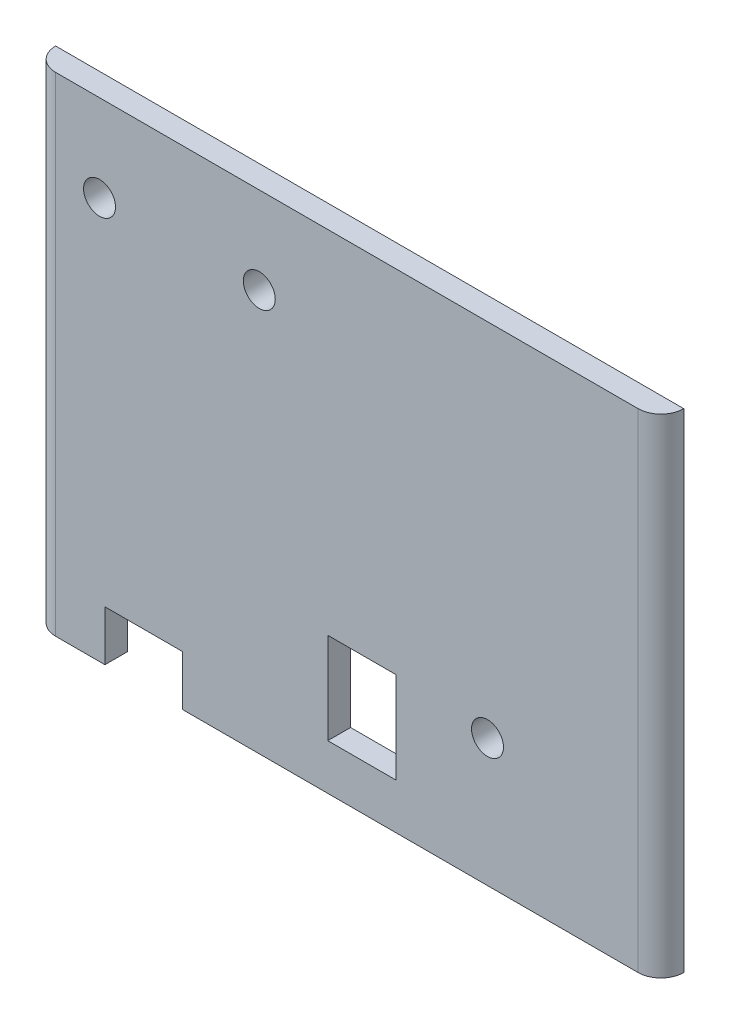
ISO-10303-21;
HEADER;
FILE_DESCRIPTION(('STEP AP214'),'2;1');
FILE_NAME('part.step','',(''),(''),'','','');
FILE_SCHEMA(('AUTOMOTIVE_DESIGN { 1 0 10303 214 1 1 1 1 }'));
ENDSEC;
DATA;
#1=APPLICATION_CONTEXT('core data for automotive mechanical design processes');
#2=APPLICATION_PROTOCOL_DEFINITION('international standard','automotive_design',2000,#1);
#3=PRODUCT_CONTEXT('',#1,'mechanical');
#4=PRODUCT('Part','Part','',(#3));
#5=PRODUCT_RELATED_PRODUCT_CATEGORY('part','',(#4));
#6=PRODUCT_DEFINITION_FORMATION('','',#4);
#7=PRODUCT_DEFINITION_CONTEXT('part definition',#1,'design');
#8=PRODUCT_DEFINITION('design','',#6,#7);
#9=PRODUCT_DEFINITION_SHAPE('','',#8);
#10=(LENGTH_UNIT() NAMED_UNIT(*) SI_UNIT(.MILLI.,.METRE.));
#11=(NAMED_UNIT(*) PLANE_ANGLE_UNIT() SI_UNIT($,.RADIAN.));
#12=(NAMED_UNIT(*) SI_UNIT($,.STERADIAN.) SOLID_ANGLE_UNIT());
#13=UNCERTAINTY_MEASURE_WITH_UNIT(LENGTH_MEASURE(1.E-05),#10,'distance_accuracy_value','');
#14=(GEOMETRIC_REPRESENTATION_CONTEXT(3) GLOBAL_UNCERTAINTY_ASSIGNED_CONTEXT((#13)) GLOBAL_UNIT_ASSIGNED_CONTEXT((#10,
#11,#12)) REPRESENTATION_CONTEXT('',''));
#15=CARTESIAN_POINT('',(0.,0.,0.));
#16=DIRECTION('',(0.,0.,1.));
#17=DIRECTION('',(1.,0.,0.));
#18=AXIS2_PLACEMENT_3D('',#15,#16,#17);
#19=CARTESIAN_POINT('',(5.38,138.622751322752,65.));
#20=DIRECTION('',(0.,0.,1.));
#21=DIRECTION('',(0.,-1.,0.));
#22=AXIS2_PLACEMENT_3D('',#19,#20,#21);
#23=PLANE('',#22);
#24=DIRECTION('',(0.,-1.,0.));
#25=VECTOR('',#24,1.);
#26=CARTESIAN_POINT('',(24.,120.,65.));
#27=LINE('',#26,#25);
#28=CARTESIAN_POINT('',(24.,120.,65.));
#29=VERTEX_POINT('',#28);
#30=CARTESIAN_POINT('',(24.,112.,65.));
#31=VERTEX_POINT('',#30);
#32=EDGE_CURVE('E217',#29,#31,#27,.T.);
#33=ORIENTED_EDGE('',*,*,#32,.F.);
#34=DIRECTION('',(1.,0.,0.));
#35=VECTOR('',#34,1.);
#36=CARTESIAN_POINT('',(16.,120.,65.));
#37=LINE('',#36,#35);
#38=CARTESIAN_POINT('',(16.,120.,65.));
#39=VERTEX_POINT('',#38);
#40=EDGE_CURVE('E230',#39,#29,#37,.T.);
#41=ORIENTED_EDGE('',*,*,#40,.F.);
#42=DIRECTION('',(0.,1.,0.));
#43=VECTOR('',#42,1.);
#44=CARTESIAN_POINT('',(16.,120.,65.));
#45=LINE('',#44,#43);
#46=CARTESIAN_POINT('',(16.,112.,65.));
#47=VERTEX_POINT('',#46);
#48=EDGE_CURVE('E239',#47,#39,#45,.T.);
#49=ORIENTED_EDGE('',*,*,#48,.F.);
#50=DIRECTION('',(-1.,0.,0.));
#51=VECTOR('',#50,1.);
#52=CARTESIAN_POINT('',(16.,112.,65.));
#53=LINE('',#52,#51);
#54=EDGE_CURVE('E220',#31,#47,#53,.T.);
#55=ORIENTED_EDGE('',*,*,#54,.F.);
#56=EDGE_LOOP('',(#33,#41,#49,#55));
#57=FACE_BOUND('',#56,.T.);
#58=DIRECTION('',(-1.,0.,0.));
#59=VECTOR('',#58,1.);
#60=CARTESIAN_POINT('',(70.,38.,65.));
#61=LINE('',#60,#59);
#62=CARTESIAN_POINT('',(85.,38.,65.));
#63=VERTEX_POINT('',#62);
#64=CARTESIAN_POINT('',(70.,38.,65.));
#65=VERTEX_POINT('',#64);
#66=EDGE_CURVE('E309',#63,#65,#61,.T.);
#67=ORIENTED_EDGE('',*,*,#66,.F.);
#68=DIRECTION('',(0.,-1.,0.));
#69=VECTOR('',#68,1.);
#70=CARTESIAN_POINT('',(85.,38.,65.));
#71=LINE('',#70,#69);
#72=CARTESIAN_POINT('',(85.,58.,65.));
#73=VERTEX_POINT('',#72);
#74=EDGE_CURVE('E312',#73,#63,#71,.T.);
#75=ORIENTED_EDGE('',*,*,#74,.F.);
#76=DIRECTION('',(1.,0.,0.));
#77=VECTOR('',#76,1.);
#78=CARTESIAN_POINT('',(70.,58.,65.));
#79=LINE('',#78,#77);
#80=CARTESIAN_POINT('',(70.,58.,65.));
#81=VERTEX_POINT('',#80);
#82=EDGE_CURVE('E315',#81,#73,#79,.T.);
#83=ORIENTED_EDGE('',*,*,#82,.F.);
#84=DIRECTION('',(0.,1.,0.));
#85=VECTOR('',#84,1.);
#86=CARTESIAN_POINT('',(70.,38.,65.));
#87=LINE('',#86,#85);
#88=EDGE_CURVE('E318',#65,#81,#87,.T.);
#89=ORIENTED_EDGE('',*,*,#88,.F.);
#90=EDGE_LOOP('',(#67,#75,#83,#89));
#91=FACE_BOUND('',#90,.T.);
#92=DIRECTION('',(0.,1.,0.));
#93=VECTOR('',#92,1.);
#94=CARTESIAN_POINT('',(143.,0.,65.));
#95=LINE('',#94,#93);
#96=CARTESIAN_POINT('',(143.,28.,65.));
#97=VERTEX_POINT('',#96);
#98=CARTESIAN_POINT('',(143.,135.,65.));
#99=VERTEX_POINT('',#98);
#100=EDGE_CURVE('E303',#97,#99,#95,.T.);
#101=ORIENTED_EDGE('',*,*,#100,.F.);
#102=DIRECTION('',(1.,0.,0.));
#103=VECTOR('',#102,1.);
#104=CARTESIAN_POINT('',(0.,28.,65.));
#105=LINE('',#104,#103);
#106=CARTESIAN_POINT('',(38.18,28.0000000000001,65.));
#107=VERTEX_POINT('',#106);
#108=EDGE_CURVE('E300',#107,#97,#105,.T.);
#109=ORIENTED_EDGE('',*,*,#108,.F.);
#110=DIRECTION('',(0.,-1.,0.));
#111=VECTOR('',#110,1.);
#112=CARTESIAN_POINT('',(38.18,28.0000000000001,65.));
#113=LINE('',#112,#111);
#114=CARTESIAN_POINT('',(38.18,39.0000000000001,65.));
#115=VERTEX_POINT('',#114);
#116=EDGE_CURVE('E297',#115,#107,#113,.T.);
#117=ORIENTED_EDGE('',*,*,#116,.F.);
#118=DIRECTION('',(1.,0.,0.));
#119=VECTOR('',#118,1.);
#120=CARTESIAN_POINT('',(21.18,39.0000000000001,65.));
#121=LINE('',#120,#119);
#122=CARTESIAN_POINT('',(21.18,39.0000000000001,65.));
#123=VERTEX_POINT('',#122);
#124=EDGE_CURVE('E294',#123,#115,#121,.T.);
#125=ORIENTED_EDGE('',*,*,#124,.F.);
#126=DIRECTION('',(0.,1.,0.));
#127=VECTOR('',#126,1.);
#128=CARTESIAN_POINT('',(21.18,28.0000000000001,65.));
#129=LINE('',#128,#127);
#130=CARTESIAN_POINT('',(21.18,28.0000000000001,65.));
#131=VERTEX_POINT('',#130);
#132=EDGE_CURVE('E291',#131,#123,#129,.T.);
#133=ORIENTED_EDGE('',*,*,#132,.F.);
#134=DIRECTION('',(1.,0.,0.));
#135=VECTOR('',#134,1.);
#136=CARTESIAN_POINT('',(0.,28.,65.));
#137=LINE('',#136,#135);
#138=CARTESIAN_POINT('',(5.38,28.,65.));
#139=VERTEX_POINT('',#138);
#140=EDGE_CURVE('E366',#139,#131,#137,.T.);
#141=ORIENTED_EDGE('',*,*,#140,.F.);
#142=DIRECTION('',(0.,-1.,0.));
#143=VECTOR('',#142,1.);
#144=CARTESIAN_POINT('',(5.38,138.622751322752,65.));
#145=LINE('',#144,#143);
#146=CARTESIAN_POINT('',(5.38,135.,65.));
#147=VERTEX_POINT('',#146);
#148=EDGE_CURVE('E288',#147,#139,#145,.T.);
#149=ORIENTED_EDGE('',*,*,#148,.F.);
#150=DIRECTION('',(-1.,0.,0.));
#151=VECTOR('',#150,1.);
#152=CARTESIAN_POINT('',(0.,135.,65.));
#153=LINE('',#152,#151);
#154=EDGE_CURVE('E306',#99,#147,#153,.T.);
#155=ORIENTED_EDGE('',*,*,#154,.F.);
#156=EDGE_LOOP('',(#101,#109,#117,#125,#133,#141,#149,#155));
#157=FACE_BOUND('',#156,.T.);
#158=DIRECTION('',(0.,1.,0.));
#159=VECTOR('',#158,1.);
#160=CARTESIAN_POINT('',(51.,112.,65.));
#161=LINE('',#160,#159);
#162=CARTESIAN_POINT('',(51.,112.,65.));
#163=VERTEX_POINT('',#162);
#164=CARTESIAN_POINT('',(51.,120.,65.));
#165=VERTEX_POINT('',#164);
#166=EDGE_CURVE('E255',#163,#165,#161,.T.);
#167=ORIENTED_EDGE('',*,*,#166,.F.);
#168=DIRECTION('',(-1.,0.,0.));
#169=VECTOR('',#168,1.);
#170=CARTESIAN_POINT('',(59.,112.,65.));
#171=LINE('',#170,#169);
#172=CARTESIAN_POINT('',(59.,112.,65.));
#173=VERTEX_POINT('',#172);
#174=EDGE_CURVE('E260',#173,#163,#171,.T.);
#175=ORIENTED_EDGE('',*,*,#174,.F.);
#176=DIRECTION('',(0.,-1.,0.));
#177=VECTOR('',#176,1.);
#178=CARTESIAN_POINT('',(59.,112.,65.));
#179=LINE('',#178,#177);
#180=CARTESIAN_POINT('',(59.,120.,65.));
#181=VERTEX_POINT('',#180);
#182=EDGE_CURVE('E272',#181,#173,#179,.T.);
#183=ORIENTED_EDGE('',*,*,#182,.F.);
#184=DIRECTION('',(1.,0.,0.));
#185=VECTOR('',#184,1.);
#186=CARTESIAN_POINT('',(59.,120.,65.));
#187=LINE('',#186,#185);
#188=EDGE_CURVE('E269',#165,#181,#187,.T.);
#189=ORIENTED_EDGE('',*,*,#188,.F.);
#190=EDGE_LOOP('',(#167,#175,#183,#189));
#191=FACE_BOUND('',#190,.T.);
#192=DIRECTION('',(0.,1.,0.));
#193=VECTOR('',#192,1.);
#194=CARTESIAN_POINT('',(101.,52.,65.));
#195=LINE('',#194,#193);
#196=CARTESIAN_POINT('',(101.,52.,65.));
#197=VERTEX_POINT('',#196);
#198=CARTESIAN_POINT('',(101.,60.0000000000001,65.));
#199=VERTEX_POINT('',#198);
#200=EDGE_CURVE('E216',#197,#199,#195,.T.);
#201=ORIENTED_EDGE('',*,*,#200,.F.);
#202=DIRECTION('',(-1.,0.,0.));
#203=VECTOR('',#202,1.);
#204=CARTESIAN_POINT('',(109.,52.,65.));
#205=LINE('',#204,#203);
#206=CARTESIAN_POINT('',(109.,52.,65.));
#207=VERTEX_POINT('',#206);
#208=EDGE_CURVE('E213',#207,#197,#205,.T.);
#209=ORIENTED_EDGE('',*,*,#208,.F.);
#210=DIRECTION('',(0.,-1.,0.));
#211=VECTOR('',#210,1.);
#212=CARTESIAN_POINT('',(109.,52.,65.));
#213=LINE('',#212,#211);
#214=CARTESIAN_POINT('',(109.,60.0000000000001,65.));
#215=VERTEX_POINT('',#214);
#216=EDGE_CURVE('E56',#215,#207,#213,.T.);
#217=ORIENTED_EDGE('',*,*,#216,.F.);
#218=DIRECTION('',(1.,0.,0.));
#219=VECTOR('',#218,1.);
#220=CARTESIAN_POINT('',(109.,60.0000000000001,65.));
#221=LINE('',#220,#219);
#222=EDGE_CURVE('E51',#199,#215,#221,.T.);
#223=ORIENTED_EDGE('',*,*,#222,.F.);
#224=EDGE_LOOP('',(#201,#209,#217,#223));
#225=FACE_BOUND('',#224,.T.);
#226=ADVANCED_FACE('F34',(#57,#91,#157,#191,#225),#23,.F.);
#227=CARTESIAN_POINT('',(0.,135.,70.));
#228=DIRECTION('',(0.,-1.,0.));
#229=DIRECTION('',(0.,0.,-1.));
#230=AXIS2_PLACEMENT_3D('',#227,#228,#229);
#231=PLANE('',#230);
#232=ORIENTED_EDGE('',*,*,#154,.T.);
#233=CARTESIAN_POINT('',(10.38,135.,65.));
#234=DIRECTION('',(0.,-1.,0.));
#235=DIRECTION('',(0.,0.,-1.));
#236=AXIS2_PLACEMENT_3D('',#233,#234,#235);
#237=CIRCLE('',#236,5.);
#238=CARTESIAN_POINT('',(10.38,135.,70.));
#239=VERTEX_POINT('',#238);
#240=EDGE_CURVE('E43',#147,#239,#237,.F.);
#241=ORIENTED_EDGE('',*,*,#240,.T.);
#242=DIRECTION('',(-1.,0.,0.));
#243=VECTOR('',#242,1.);
#244=CARTESIAN_POINT('',(0.,135.,70.));
#245=LINE('',#244,#243);
#246=CARTESIAN_POINT('',(138.,135.,70.));
#247=VERTEX_POINT('',#246);
#248=EDGE_CURVE('E338',#247,#239,#245,.T.);
#249=ORIENTED_EDGE('',*,*,#248,.F.);
#250=CARTESIAN_POINT('',(138.,135.,65.));
#251=DIRECTION('',(0.,-1.,0.));
#252=DIRECTION('',(0.,0.,-1.));
#253=AXIS2_PLACEMENT_3D('',#250,#251,#252);
#254=CIRCLE('',#253,5.);
#255=EDGE_CURVE('E377',#247,#99,#254,.F.);
#256=ORIENTED_EDGE('',*,*,#255,.T.);
#257=EDGE_LOOP('',(#232,#241,#249,#256));
#258=FACE_BOUND('',#257,.T.);
#259=ADVANCED_FACE('F425',(#258),#231,.F.);
#260=CARTESIAN_POINT('',(0.,0.,70.));
#261=DIRECTION('',(0.,0.,-1.));
#262=DIRECTION('',(-1.,0.,0.));
#263=AXIS2_PLACEMENT_3D('',#260,#261,#262);
#264=PLANE('',#263);
#265=CARTESIAN_POINT('',(20.,116.,70.));
#266=DIRECTION('',(0.,0.,1.));
#267=DIRECTION('',(1.,0.,0.));
#268=AXIS2_PLACEMENT_3D('',#265,#266,#267);
#269=CIRCLE('',#268,3.5);
#270=CARTESIAN_POINT('',(23.5,116.,70.));
#271=VERTEX_POINT('',#270);
#272=EDGE_CURVE('E776',#271,#271,#269,.T.);
#273=ORIENTED_EDGE('',*,*,#272,.F.);
#274=EDGE_LOOP('',(#273));
#275=FACE_BOUND('',#274,.T.);
#276=CARTESIAN_POINT('',(55.,116.,70.));
#277=DIRECTION('',(0.,0.,1.));
#278=DIRECTION('',(1.,0.,0.));
#279=AXIS2_PLACEMENT_3D('',#276,#277,#278);
#280=CIRCLE('',#279,3.5);
#281=CARTESIAN_POINT('',(58.5,116.,70.));
#282=VERTEX_POINT('',#281);
#283=EDGE_CURVE('E397',#282,#282,#280,.T.);
#284=ORIENTED_EDGE('',*,*,#283,.F.);
#285=EDGE_LOOP('',(#284));
#286=FACE_BOUND('',#285,.T.);
#287=CARTESIAN_POINT('',(105.,56.0000000000001,70.));
#288=DIRECTION('',(0.,0.,1.));
#289=DIRECTION('',(1.,0.,0.));
#290=AXIS2_PLACEMENT_3D('',#287,#288,#289);
#291=CIRCLE('',#290,3.50000000000001);
#292=CARTESIAN_POINT('',(108.5,56.0000000000001,70.));
#293=VERTEX_POINT('',#292);
#294=EDGE_CURVE('E388',#293,#293,#291,.T.);
#295=ORIENTED_EDGE('',*,*,#294,.F.);
#296=EDGE_LOOP('',(#295));
#297=FACE_BOUND('',#296,.T.);
#298=ORIENTED_EDGE('',*,*,#248,.T.);
#299=DIRECTION('',(0.,-1.,0.));
#300=VECTOR('',#299,1.);
#301=CARTESIAN_POINT('',(10.38,0.,70.));
#302=LINE('',#301,#300);
#303=CARTESIAN_POINT('',(10.38,28.,70.));
#304=VERTEX_POINT('',#303);
#305=EDGE_CURVE('E372',#239,#304,#302,.T.);
#306=ORIENTED_EDGE('',*,*,#305,.T.);
#307=DIRECTION('',(1.,0.,0.));
#308=VECTOR('',#307,1.);
#309=CARTESIAN_POINT('',(0.,28.,70.));
#310=LINE('',#309,#308);
#311=CARTESIAN_POINT('',(21.18,28.0000000000001,70.));
#312=VERTEX_POINT('',#311);
#313=EDGE_CURVE('E324',#304,#312,#310,.T.);
#314=ORIENTED_EDGE('',*,*,#313,.T.);
#315=DIRECTION('',(0.,-1.,0.));
#316=VECTOR('',#315,1.);
#317=CARTESIAN_POINT('',(21.18,28.0000000000001,70.));
#318=LINE('',#317,#316);
#319=CARTESIAN_POINT('',(21.18,39.0000000000001,70.));
#320=VERTEX_POINT('',#319);
#321=EDGE_CURVE('E325',#320,#312,#318,.T.);
#322=ORIENTED_EDGE('',*,*,#321,.F.);
#323=DIRECTION('',(-1.,0.,0.));
#324=VECTOR('',#323,1.);
#325=CARTESIAN_POINT('',(21.18,39.0000000000001,70.));
#326=LINE('',#325,#324);
#327=CARTESIAN_POINT('',(38.18,39.0000000000001,70.));
#328=VERTEX_POINT('',#327);
#329=EDGE_CURVE('E332',#328,#320,#326,.T.);
#330=ORIENTED_EDGE('',*,*,#329,.F.);
#331=DIRECTION('',(0.,1.,0.));
#332=VECTOR('',#331,1.);
#333=CARTESIAN_POINT('',(38.18,28.0000000000001,70.));
#334=LINE('',#333,#332);
#335=CARTESIAN_POINT('',(38.18,28.0000000000001,70.));
#336=VERTEX_POINT('',#335);
#337=EDGE_CURVE('E328',#336,#328,#334,.T.);
#338=ORIENTED_EDGE('',*,*,#337,.F.);
#339=CARTESIAN_POINT('',(138.,28.,70.));
#340=VERTEX_POINT('',#339);
#341=EDGE_CURVE('E321',#336,#340,#310,.T.);
#342=ORIENTED_EDGE('',*,*,#341,.T.);
#343=DIRECTION('',(0.,1.,0.));
#344=VECTOR('',#343,1.);
#345=CARTESIAN_POINT('',(138.,0.,70.));
#346=LINE('',#345,#344);
#347=EDGE_CURVE('E369',#340,#247,#346,.T.);
#348=ORIENTED_EDGE('',*,*,#347,.T.);
#349=EDGE_LOOP('',(#298,#306,#314,#322,#330,#338,#342,#348));
#350=FACE_BOUND('',#349,.T.);
#351=DIRECTION('',(1.,0.,0.));
#352=VECTOR('',#351,1.);
#353=CARTESIAN_POINT('',(70.,38.,70.));
#354=LINE('',#353,#352);
#355=CARTESIAN_POINT('',(70.,38.,70.));
#356=VERTEX_POINT('',#355);
#357=CARTESIAN_POINT('',(85.,38.,70.));
#358=VERTEX_POINT('',#357);
#359=EDGE_CURVE('E348',#356,#358,#354,.T.);
#360=ORIENTED_EDGE('',*,*,#359,.F.);
#361=DIRECTION('',(0.,-1.,0.));
#362=VECTOR('',#361,1.);
#363=CARTESIAN_POINT('',(70.,38.,70.));
#364=LINE('',#363,#362);
#365=CARTESIAN_POINT('',(70.,58.,70.));
#366=VERTEX_POINT('',#365);
#367=EDGE_CURVE('E345',#366,#356,#364,.T.);
#368=ORIENTED_EDGE('',*,*,#367,.F.);
#369=DIRECTION('',(-1.,0.,0.));
#370=VECTOR('',#369,1.);
#371=CARTESIAN_POINT('',(70.,58.,70.));
#372=LINE('',#371,#370);
#373=CARTESIAN_POINT('',(85.,58.,70.));
#374=VERTEX_POINT('',#373);
#375=EDGE_CURVE('E354',#374,#366,#372,.T.);
#376=ORIENTED_EDGE('',*,*,#375,.F.);
#377=DIRECTION('',(0.,1.,0.));
#378=VECTOR('',#377,1.);
#379=CARTESIAN_POINT('',(85.,38.,70.));
#380=LINE('',#379,#378);
#381=EDGE_CURVE('E351',#358,#374,#380,.T.);
#382=ORIENTED_EDGE('',*,*,#381,.F.);
#383=EDGE_LOOP('',(#360,#368,#376,#382));
#384=FACE_BOUND('',#383,.T.);
#385=ADVANCED_FACE('F431',(#275,#286,#297,#350,#384),#264,.F.);
#386=CARTESIAN_POINT('',(70.,38.,60.));
#387=DIRECTION('',(-1.,0.,0.));
#388=DIRECTION('',(0.,-1.,0.));
#389=AXIS2_PLACEMENT_3D('',#386,#387,#388);
#390=PLANE('',#389);
#391=DIRECTION('',(0.,0.,1.));
#392=VECTOR('',#391,1.);
#393=CARTESIAN_POINT('',(70.,38.,60.));
#394=LINE('',#393,#392);
#395=EDGE_CURVE('E357',#65,#356,#394,.T.);
#396=ORIENTED_EDGE('',*,*,#395,.F.);
#397=ORIENTED_EDGE('',*,*,#88,.T.);
#398=DIRECTION('',(0.,0.,1.));
#399=VECTOR('',#398,1.);
#400=CARTESIAN_POINT('',(70.,58.,60.));
#401=LINE('',#400,#399);
#402=EDGE_CURVE('E329',#81,#366,#401,.T.);
#403=ORIENTED_EDGE('',*,*,#402,.T.);
#404=ORIENTED_EDGE('',*,*,#367,.T.);
#405=EDGE_LOOP('',(#396,#397,#403,#404));
#406=FACE_BOUND('',#405,.T.);
#407=ADVANCED_FACE('F462',(#406),#390,.F.);
#408=CARTESIAN_POINT('',(70.,58.,60.));
#409=DIRECTION('',(0.,1.,0.));
#410=DIRECTION('',(0.,0.,1.));
#411=AXIS2_PLACEMENT_3D('',#408,#409,#410);
#412=PLANE('',#411);
#413=ORIENTED_EDGE('',*,*,#402,.F.);
#414=ORIENTED_EDGE('',*,*,#82,.T.);
#415=DIRECTION('',(0.,0.,1.));
#416=VECTOR('',#415,1.);
#417=CARTESIAN_POINT('',(85.,58.,60.));
#418=LINE('',#417,#416);
#419=EDGE_CURVE('E359',#73,#374,#418,.T.);
#420=ORIENTED_EDGE('',*,*,#419,.T.);
#421=ORIENTED_EDGE('',*,*,#375,.T.);
#422=EDGE_LOOP('',(#413,#414,#420,#421));
#423=FACE_BOUND('',#422,.T.);
#424=ADVANCED_FACE('F458',(#423),#412,.F.);
#425=CARTESIAN_POINT('',(85.,38.,60.));
#426=DIRECTION('',(1.,0.,0.));
#427=DIRECTION('',(0.,0.,-1.));
#428=AXIS2_PLACEMENT_3D('',#425,#426,#427);
#429=PLANE('',#428);
#430=ORIENTED_EDGE('',*,*,#419,.F.);
#431=ORIENTED_EDGE('',*,*,#74,.T.);
#432=DIRECTION('',(0.,0.,1.));
#433=VECTOR('',#432,1.);
#434=CARTESIAN_POINT('',(85.,38.,60.));
#435=LINE('',#434,#433);
#436=EDGE_CURVE('E361',#63,#358,#435,.T.);
#437=ORIENTED_EDGE('',*,*,#436,.T.);
#438=ORIENTED_EDGE('',*,*,#381,.T.);
#439=EDGE_LOOP('',(#430,#431,#437,#438));
#440=FACE_BOUND('',#439,.T.);
#441=ADVANCED_FACE('F461',(#440),#429,.F.);
#442=CARTESIAN_POINT('',(70.,38.,60.));
#443=DIRECTION('',(0.,-1.,0.));
#444=DIRECTION('',(0.,0.,-1.));
#445=AXIS2_PLACEMENT_3D('',#442,#443,#444);
#446=PLANE('',#445);
#447=ORIENTED_EDGE('',*,*,#436,.F.);
#448=ORIENTED_EDGE('',*,*,#66,.T.);
#449=ORIENTED_EDGE('',*,*,#395,.T.);
#450=ORIENTED_EDGE('',*,*,#359,.T.);
#451=EDGE_LOOP('',(#447,#448,#449,#450));
#452=FACE_BOUND('',#451,.T.);
#453=ADVANCED_FACE('F456',(#452),#446,.F.);
#454=CARTESIAN_POINT('',(21.18,28.0000000000001,60.));
#455=DIRECTION('',(-1.,0.,0.));
#456=DIRECTION('',(0.,0.,1.));
#457=AXIS2_PLACEMENT_3D('',#454,#455,#456);
#458=PLANE('',#457);
#459=DIRECTION('',(0.,0.,1.));
#460=VECTOR('',#459,1.);
#461=CARTESIAN_POINT('',(21.18,28.0000000000001,60.));
#462=LINE('',#461,#460);
#463=EDGE_CURVE('E335',#131,#312,#462,.T.);
#464=ORIENTED_EDGE('',*,*,#463,.F.);
#465=ORIENTED_EDGE('',*,*,#132,.T.);
#466=DIRECTION('',(0.,0.,1.));
#467=VECTOR('',#466,1.);
#468=CARTESIAN_POINT('',(21.18,39.0000000000001,60.));
#469=LINE('',#468,#467);
#470=EDGE_CURVE('E336',#123,#320,#469,.T.);
#471=ORIENTED_EDGE('',*,*,#470,.T.);
#472=ORIENTED_EDGE('',*,*,#321,.T.);
#473=EDGE_LOOP('',(#464,#465,#471,#472));
#474=FACE_BOUND('',#473,.T.);
#475=ADVANCED_FACE('F449',(#474),#458,.F.);
#476=CARTESIAN_POINT('',(21.18,39.0000000000001,60.));
#477=DIRECTION('',(0.,1.,0.));
#478=DIRECTION('',(0.,0.,1.));
#479=AXIS2_PLACEMENT_3D('',#476,#477,#478);
#480=PLANE('',#479);
#481=ORIENTED_EDGE('',*,*,#470,.F.);
#482=ORIENTED_EDGE('',*,*,#124,.T.);
#483=DIRECTION('',(0.,0.,1.));
#484=VECTOR('',#483,1.);
#485=CARTESIAN_POINT('',(38.18,39.0000000000001,60.));
#486=LINE('',#485,#484);
#487=EDGE_CURVE('E339',#115,#328,#486,.T.);
#488=ORIENTED_EDGE('',*,*,#487,.T.);
#489=ORIENTED_EDGE('',*,*,#329,.T.);
#490=EDGE_LOOP('',(#481,#482,#488,#489));
#491=FACE_BOUND('',#490,.T.);
#492=ADVANCED_FACE('F445',(#491),#480,.F.);
#493=CARTESIAN_POINT('',(38.18,28.0000000000001,60.));
#494=DIRECTION('',(1.,0.,0.));
#495=DIRECTION('',(0.,0.,-1.));
#496=AXIS2_PLACEMENT_3D('',#493,#494,#495);
#497=PLANE('',#496);
#498=ORIENTED_EDGE('',*,*,#487,.F.);
#499=ORIENTED_EDGE('',*,*,#116,.T.);
#500=DIRECTION('',(0.,0.,1.));
#501=VECTOR('',#500,1.);
#502=CARTESIAN_POINT('',(38.18,28.0000000000001,60.));
#503=LINE('',#502,#501);
#504=EDGE_CURVE('E341',#107,#336,#503,.T.);
#505=ORIENTED_EDGE('',*,*,#504,.T.);
#506=ORIENTED_EDGE('',*,*,#337,.T.);
#507=EDGE_LOOP('',(#498,#499,#505,#506));
#508=FACE_BOUND('',#507,.T.);
#509=ADVANCED_FACE('F448',(#508),#497,.F.);
#510=CARTESIAN_POINT('',(0.,28.,60.));
#511=DIRECTION('',(0.,1.,0.));
#512=DIRECTION('',(-1.,0.,0.));
#513=AXIS2_PLACEMENT_3D('',#510,#511,#512);
#514=PLANE('',#513);
#515=ORIENTED_EDGE('',*,*,#108,.T.);
#516=CARTESIAN_POINT('',(138.,28.,65.));
#517=DIRECTION('',(0.,1.,0.));
#518=DIRECTION('',(-1.,0.,0.));
#519=AXIS2_PLACEMENT_3D('',#516,#517,#518);
#520=CIRCLE('',#519,5.);
#521=EDGE_CURVE('E11',#97,#340,#520,.F.);
#522=ORIENTED_EDGE('',*,*,#521,.T.);
#523=ORIENTED_EDGE('',*,*,#341,.F.);
#524=ORIENTED_EDGE('',*,*,#504,.F.);
#525=EDGE_LOOP('',(#515,#522,#523,#524));
#526=FACE_BOUND('',#525,.T.);
#527=ADVANCED_FACE('F443',(#526),#514,.F.);
#528=ORIENTED_EDGE('',*,*,#313,.F.);
#529=CARTESIAN_POINT('',(10.38,28.,65.));
#530=DIRECTION('',(0.,1.,0.));
#531=DIRECTION('',(-1.,0.,0.));
#532=AXIS2_PLACEMENT_3D('',#529,#530,#531);
#533=CIRCLE('',#532,5.);
#534=EDGE_CURVE('E375',#304,#139,#533,.F.);
#535=ORIENTED_EDGE('',*,*,#534,.T.);
#536=ORIENTED_EDGE('',*,*,#140,.T.);
#537=ORIENTED_EDGE('',*,*,#463,.T.);
#538=EDGE_LOOP('',(#528,#535,#536,#537));
#539=FACE_BOUND('',#538,.T.);
#540=ADVANCED_FACE('F439',(#539),#514,.F.);
#541=CARTESIAN_POINT('',(10.38,0.,65.));
#542=DIRECTION('',(0.,-1.,0.));
#543=DIRECTION('',(0.,0.,-1.));
#544=AXIS2_PLACEMENT_3D('',#541,#542,#543);
#545=CYLINDRICAL_SURFACE('',#544,5.);
#546=ORIENTED_EDGE('',*,*,#240,.F.);
#547=ORIENTED_EDGE('',*,*,#148,.T.);
#548=ORIENTED_EDGE('',*,*,#534,.F.);
#549=ORIENTED_EDGE('',*,*,#305,.F.);
#550=EDGE_LOOP('',(#546,#547,#548,#549));
#551=FACE_BOUND('',#550,.T.);
#552=ADVANCED_FACE('F442',(#551),#545,.T.);
#553=CARTESIAN_POINT('',(138.,0.,65.));
#554=DIRECTION('',(0.,1.,0.));
#555=DIRECTION('',(0.,0.,1.));
#556=AXIS2_PLACEMENT_3D('',#553,#554,#555);
#557=CYLINDRICAL_SURFACE('',#556,5.);
#558=ORIENTED_EDGE('',*,*,#521,.F.);
#559=ORIENTED_EDGE('',*,*,#100,.T.);
#560=ORIENTED_EDGE('',*,*,#255,.F.);
#561=ORIENTED_EDGE('',*,*,#347,.F.);
#562=EDGE_LOOP('',(#558,#559,#560,#561));
#563=FACE_BOUND('',#562,.T.);
#564=ADVANCED_FACE('F36',(#563),#557,.T.);
#565=CARTESIAN_POINT('',(0.,0.,62.));
#566=DIRECTION('',(0.,0.,1.));
#567=DIRECTION('',(1.,0.,0.));
#568=AXIS2_PLACEMENT_3D('',#565,#566,#567);
#569=PLANE('',#568);
#570=CARTESIAN_POINT('',(55.,116.,62.));
#571=DIRECTION('',(0.,0.,1.));
#572=DIRECTION('',(1.,0.,0.));
#573=AXIS2_PLACEMENT_3D('',#570,#571,#572);
#574=CIRCLE('',#573,2.1);
#575=CARTESIAN_POINT('',(57.1,116.,62.));
#576=VERTEX_POINT('',#575);
#577=EDGE_CURVE('E767',#576,#576,#574,.T.);
#578=ORIENTED_EDGE('',*,*,#577,.T.);
#579=EDGE_LOOP('',(#578));
#580=FACE_BOUND('',#579,.T.);
#581=DIRECTION('',(0.,1.,0.));
#582=VECTOR('',#581,1.);
#583=CARTESIAN_POINT('',(51.,112.,62.));
#584=LINE('',#583,#582);
#585=CARTESIAN_POINT('',(51.,112.,62.));
#586=VERTEX_POINT('',#585);
#587=CARTESIAN_POINT('',(51.,120.,62.));
#588=VERTEX_POINT('',#587);
#589=EDGE_CURVE('E256',#586,#588,#584,.T.);
#590=ORIENTED_EDGE('',*,*,#589,.T.);
#591=DIRECTION('',(1.,0.,0.));
#592=VECTOR('',#591,1.);
#593=CARTESIAN_POINT('',(59.,120.,62.));
#594=LINE('',#593,#592);
#595=CARTESIAN_POINT('',(59.,120.,62.));
#596=VERTEX_POINT('',#595);
#597=EDGE_CURVE('E259',#588,#596,#594,.T.);
#598=ORIENTED_EDGE('',*,*,#597,.T.);
#599=DIRECTION('',(0.,-1.,0.));
#600=VECTOR('',#599,1.);
#601=CARTESIAN_POINT('',(59.,112.,62.));
#602=LINE('',#601,#600);
#603=CARTESIAN_POINT('',(59.,112.,62.));
#604=VERTEX_POINT('',#603);
#605=EDGE_CURVE('E262',#596,#604,#602,.T.);
#606=ORIENTED_EDGE('',*,*,#605,.T.);
#607=DIRECTION('',(-1.,0.,0.));
#608=VECTOR('',#607,1.);
#609=CARTESIAN_POINT('',(59.,112.,62.));
#610=LINE('',#609,#608);
#611=EDGE_CURVE('E264',#604,#586,#610,.T.);
#612=ORIENTED_EDGE('',*,*,#611,.T.);
#613=EDGE_LOOP('',(#590,#598,#606,#612));
#614=FACE_BOUND('',#613,.T.);
#615=ADVANCED_FACE('F480',(#580,#614),#569,.F.);
#616=CARTESIAN_POINT('',(59.,112.,62.));
#617=DIRECTION('',(0.,1.,0.));
#618=DIRECTION('',(0.,0.,1.));
#619=AXIS2_PLACEMENT_3D('',#616,#617,#618);
#620=PLANE('',#619);
#621=ORIENTED_EDGE('',*,*,#174,.T.);
#622=DIRECTION('',(0.,0.,1.));
#623=VECTOR('',#622,1.);
#624=CARTESIAN_POINT('',(51.,112.,62.));
#625=LINE('',#624,#623);
#626=EDGE_CURVE('E266',#586,#163,#625,.T.);
#627=ORIENTED_EDGE('',*,*,#626,.F.);
#628=ORIENTED_EDGE('',*,*,#611,.F.);
#629=DIRECTION('',(0.,0.,1.));
#630=VECTOR('',#629,1.);
#631=CARTESIAN_POINT('',(59.,112.,62.));
#632=LINE('',#631,#630);
#633=EDGE_CURVE('E279',#604,#173,#632,.T.);
#634=ORIENTED_EDGE('',*,*,#633,.T.);
#635=EDGE_LOOP('',(#621,#627,#628,#634));
#636=FACE_BOUND('',#635,.T.);
#637=ADVANCED_FACE('F535',(#636),#620,.F.);
#638=CARTESIAN_POINT('',(59.,112.,62.));
#639=DIRECTION('',(-1.,0.,0.));
#640=DIRECTION('',(0.,0.,1.));
#641=AXIS2_PLACEMENT_3D('',#638,#639,#640);
#642=PLANE('',#641);
#643=ORIENTED_EDGE('',*,*,#182,.T.);
#644=ORIENTED_EDGE('',*,*,#633,.F.);
#645=ORIENTED_EDGE('',*,*,#605,.F.);
#646=DIRECTION('',(0.,0.,1.));
#647=VECTOR('',#646,1.);
#648=CARTESIAN_POINT('',(59.,120.,62.));
#649=LINE('',#648,#647);
#650=EDGE_CURVE('E282',#596,#181,#649,.T.);
#651=ORIENTED_EDGE('',*,*,#650,.T.);
#652=EDGE_LOOP('',(#643,#644,#645,#651));
#653=FACE_BOUND('',#652,.T.);
#654=ADVANCED_FACE('F540',(#653),#642,.F.);
#655=CARTESIAN_POINT('',(59.,120.,62.));
#656=DIRECTION('',(0.,-1.,0.));
#657=DIRECTION('',(0.,0.,-1.));
#658=AXIS2_PLACEMENT_3D('',#655,#656,#657);
#659=PLANE('',#658);
#660=ORIENTED_EDGE('',*,*,#188,.T.);
#661=ORIENTED_EDGE('',*,*,#650,.F.);
#662=ORIENTED_EDGE('',*,*,#597,.F.);
#663=DIRECTION('',(0.,0.,1.));
#664=VECTOR('',#663,1.);
#665=CARTESIAN_POINT('',(51.,120.,62.));
#666=LINE('',#665,#664);
#667=EDGE_CURVE('E285',#588,#165,#666,.T.);
#668=ORIENTED_EDGE('',*,*,#667,.T.);
#669=EDGE_LOOP('',(#660,#661,#662,#668));
#670=FACE_BOUND('',#669,.T.);
#671=ADVANCED_FACE('F550',(#670),#659,.F.);
#672=CARTESIAN_POINT('',(51.,112.,62.));
#673=DIRECTION('',(1.,0.,0.));
#674=DIRECTION('',(0.,0.,-1.));
#675=AXIS2_PLACEMENT_3D('',#672,#673,#674);
#676=PLANE('',#675);
#677=ORIENTED_EDGE('',*,*,#166,.T.);
#678=ORIENTED_EDGE('',*,*,#667,.F.);
#679=ORIENTED_EDGE('',*,*,#589,.F.);
#680=ORIENTED_EDGE('',*,*,#626,.T.);
#681=EDGE_LOOP('',(#677,#678,#679,#680));
#682=FACE_BOUND('',#681,.T.);
#683=ADVANCED_FACE('F437',(#682),#676,.F.);
#684=CARTESIAN_POINT('',(24.,120.,62.));
#685=DIRECTION('',(-1.,0.,0.));
#686=DIRECTION('',(0.,0.,1.));
#687=AXIS2_PLACEMENT_3D('',#684,#685,#686);
#688=PLANE('',#687);
#689=ORIENTED_EDGE('',*,*,#32,.T.);
#690=DIRECTION('',(0.,0.,1.));
#691=VECTOR('',#690,1.);
#692=CARTESIAN_POINT('',(24.,112.,62.));
#693=LINE('',#692,#691);
#694=CARTESIAN_POINT('',(24.,112.,62.));
#695=VERTEX_POINT('',#694);
#696=EDGE_CURVE('E252',#695,#31,#693,.T.);
#697=ORIENTED_EDGE('',*,*,#696,.F.);
#698=DIRECTION('',(0.,-1.,0.));
#699=VECTOR('',#698,1.);
#700=CARTESIAN_POINT('',(24.,120.,62.));
#701=LINE('',#700,#699);
#702=CARTESIAN_POINT('',(24.,120.,62.));
#703=VERTEX_POINT('',#702);
#704=EDGE_CURVE('E226',#703,#695,#701,.T.);
#705=ORIENTED_EDGE('',*,*,#704,.F.);
#706=DIRECTION('',(0.,0.,1.));
#707=VECTOR('',#706,1.);
#708=CARTESIAN_POINT('',(24.,120.,62.));
#709=LINE('',#708,#707);
#710=EDGE_CURVE('E235',#703,#29,#709,.T.);
#711=ORIENTED_EDGE('',*,*,#710,.T.);
#712=EDGE_LOOP('',(#689,#697,#705,#711));
#713=FACE_BOUND('',#712,.T.);
#714=ADVANCED_FACE('F568',(#713),#688,.F.);
#715=CARTESIAN_POINT('',(16.,112.,62.));
#716=DIRECTION('',(0.,1.,0.));
#717=DIRECTION('',(0.,0.,1.));
#718=AXIS2_PLACEMENT_3D('',#715,#716,#717);
#719=PLANE('',#718);
#720=ORIENTED_EDGE('',*,*,#54,.T.);
#721=DIRECTION('',(0.,0.,1.));
#722=VECTOR('',#721,1.);
#723=CARTESIAN_POINT('',(16.,112.,62.));
#724=LINE('',#723,#722);
#725=CARTESIAN_POINT('',(16.,112.,62.));
#726=VERTEX_POINT('',#725);
#727=EDGE_CURVE('E249',#726,#47,#724,.T.);
#728=ORIENTED_EDGE('',*,*,#727,.F.);
#729=DIRECTION('',(-1.,0.,0.));
#730=VECTOR('',#729,1.);
#731=CARTESIAN_POINT('',(16.,112.,62.));
#732=LINE('',#731,#730);
#733=EDGE_CURVE('E229',#695,#726,#732,.T.);
#734=ORIENTED_EDGE('',*,*,#733,.F.);
#735=ORIENTED_EDGE('',*,*,#696,.T.);
#736=EDGE_LOOP('',(#720,#728,#734,#735));
#737=FACE_BOUND('',#736,.T.);
#738=ADVANCED_FACE('F578',(#737),#719,.F.);
#739=CARTESIAN_POINT('',(16.,120.,62.));
#740=DIRECTION('',(1.,0.,0.));
#741=DIRECTION('',(0.,1.,0.));
#742=AXIS2_PLACEMENT_3D('',#739,#740,#741);
#743=PLANE('',#742);
#744=ORIENTED_EDGE('',*,*,#48,.T.);
#745=DIRECTION('',(0.,0.,1.));
#746=VECTOR('',#745,1.);
#747=CARTESIAN_POINT('',(16.,120.,62.));
#748=LINE('',#747,#746);
#749=CARTESIAN_POINT('',(16.,120.,62.));
#750=VERTEX_POINT('',#749);
#751=EDGE_CURVE('E246',#750,#39,#748,.T.);
#752=ORIENTED_EDGE('',*,*,#751,.F.);
#753=DIRECTION('',(0.,1.,0.));
#754=VECTOR('',#753,1.);
#755=CARTESIAN_POINT('',(16.,120.,62.));
#756=LINE('',#755,#754);
#757=EDGE_CURVE('E232',#726,#750,#756,.T.);
#758=ORIENTED_EDGE('',*,*,#757,.F.);
#759=ORIENTED_EDGE('',*,*,#727,.T.);
#760=EDGE_LOOP('',(#744,#752,#758,#759));
#761=FACE_BOUND('',#760,.T.);
#762=ADVANCED_FACE('F589',(#761),#743,.F.);
#763=CARTESIAN_POINT('',(16.,120.,62.));
#764=DIRECTION('',(0.,-1.,0.));
#765=DIRECTION('',(0.,0.,-1.));
#766=AXIS2_PLACEMENT_3D('',#763,#764,#765);
#767=PLANE('',#766);
#768=ORIENTED_EDGE('',*,*,#40,.T.);
#769=ORIENTED_EDGE('',*,*,#710,.F.);
#770=DIRECTION('',(1.,0.,0.));
#771=VECTOR('',#770,1.);
#772=CARTESIAN_POINT('',(16.,120.,62.));
#773=LINE('',#772,#771);
#774=EDGE_CURVE('E234',#750,#703,#773,.T.);
#775=ORIENTED_EDGE('',*,*,#774,.F.);
#776=ORIENTED_EDGE('',*,*,#751,.T.);
#777=EDGE_LOOP('',(#768,#769,#775,#776));
#778=FACE_BOUND('',#777,.T.);
#779=ADVANCED_FACE('F599',(#778),#767,.F.);
#780=CARTESIAN_POINT('',(0.,0.,62.));
#781=DIRECTION('',(0.,0.,1.));
#782=DIRECTION('',(1.,0.,0.));
#783=AXIS2_PLACEMENT_3D('',#780,#781,#782);
#784=PLANE('',#783);
#785=CARTESIAN_POINT('',(20.,116.,62.));
#786=DIRECTION('',(0.,0.,1.));
#787=DIRECTION('',(1.,0.,0.));
#788=AXIS2_PLACEMENT_3D('',#785,#786,#787);
#789=CIRCLE('',#788,2.1);
#790=CARTESIAN_POINT('',(22.1,116.,62.));
#791=VERTEX_POINT('',#790);
#792=EDGE_CURVE('E383',#791,#791,#789,.F.);
#793=ORIENTED_EDGE('',*,*,#792,.F.);
#794=EDGE_LOOP('',(#793));
#795=FACE_BOUND('',#794,.T.);
#796=ORIENTED_EDGE('',*,*,#704,.T.);
#797=ORIENTED_EDGE('',*,*,#733,.T.);
#798=ORIENTED_EDGE('',*,*,#757,.T.);
#799=ORIENTED_EDGE('',*,*,#774,.T.);
#800=EDGE_LOOP('',(#796,#797,#798,#799));
#801=FACE_BOUND('',#800,.T.);
#802=ADVANCED_FACE('F609',(#795,#801),#784,.F.);
#803=CARTESIAN_POINT('',(101.,52.,62.));
#804=DIRECTION('',(1.,0.,0.));
#805=DIRECTION('',(0.,0.,-1.));
#806=AXIS2_PLACEMENT_3D('',#803,#804,#805);
#807=PLANE('',#806);
#808=ORIENTED_EDGE('',*,*,#200,.T.);
#809=DIRECTION('',(0.,0.,1.));
#810=VECTOR('',#809,1.);
#811=CARTESIAN_POINT('',(101.,60.0000000000001,62.));
#812=LINE('',#811,#810);
#813=CARTESIAN_POINT('',(101.,60.0000000000001,62.));
#814=VERTEX_POINT('',#813);
#815=EDGE_CURVE('E197',#814,#199,#812,.T.);
#816=ORIENTED_EDGE('',*,*,#815,.F.);
#817=DIRECTION('',(0.,1.,0.));
#818=VECTOR('',#817,1.);
#819=CARTESIAN_POINT('',(101.,52.,62.));
#820=LINE('',#819,#818);
#821=CARTESIAN_POINT('',(101.,52.,62.));
#822=VERTEX_POINT('',#821);
#823=EDGE_CURVE('E204',#822,#814,#820,.T.);
#824=ORIENTED_EDGE('',*,*,#823,.F.);
#825=DIRECTION('',(0.,0.,1.));
#826=VECTOR('',#825,1.);
#827=CARTESIAN_POINT('',(101.,52.,62.));
#828=LINE('',#827,#826);
#829=EDGE_CURVE('E403',#822,#197,#828,.T.);
#830=ORIENTED_EDGE('',*,*,#829,.T.);
#831=EDGE_LOOP('',(#808,#816,#824,#830));
#832=FACE_BOUND('',#831,.T.);
#833=ADVANCED_FACE('F215',(#832),#807,.F.);
#834=CARTESIAN_POINT('',(109.,60.0000000000001,62.));
#835=DIRECTION('',(0.,-1.,0.));
#836=DIRECTION('',(0.,0.,-1.));
#837=AXIS2_PLACEMENT_3D('',#834,#835,#836);
#838=PLANE('',#837);
#839=ORIENTED_EDGE('',*,*,#222,.T.);
#840=DIRECTION('',(0.,0.,1.));
#841=VECTOR('',#840,1.);
#842=CARTESIAN_POINT('',(109.,60.0000000000001,62.));
#843=LINE('',#842,#841);
#844=CARTESIAN_POINT('',(109.,60.0000000000001,62.));
#845=VERTEX_POINT('',#844);
#846=EDGE_CURVE('E200',#845,#215,#843,.T.);
#847=ORIENTED_EDGE('',*,*,#846,.F.);
#848=DIRECTION('',(1.,0.,0.));
#849=VECTOR('',#848,1.);
#850=CARTESIAN_POINT('',(109.,60.0000000000001,62.));
#851=LINE('',#850,#849);
#852=EDGE_CURVE('E193',#814,#845,#851,.T.);
#853=ORIENTED_EDGE('',*,*,#852,.F.);
#854=ORIENTED_EDGE('',*,*,#815,.T.);
#855=EDGE_LOOP('',(#839,#847,#853,#854));
#856=FACE_BOUND('',#855,.T.);
#857=ADVANCED_FACE('F195',(#856),#838,.F.);
#858=CARTESIAN_POINT('',(109.,52.,62.));
#859=DIRECTION('',(-1.,0.,0.));
#860=DIRECTION('',(0.,0.,1.));
#861=AXIS2_PLACEMENT_3D('',#858,#859,#860);
#862=PLANE('',#861);
#863=ORIENTED_EDGE('',*,*,#216,.T.);
#864=DIRECTION('',(0.,0.,1.));
#865=VECTOR('',#864,1.);
#866=CARTESIAN_POINT('',(109.,52.,62.));
#867=LINE('',#866,#865);
#868=CARTESIAN_POINT('',(109.,52.,62.));
#869=VERTEX_POINT('',#868);
#870=EDGE_CURVE('E222',#869,#207,#867,.T.);
#871=ORIENTED_EDGE('',*,*,#870,.F.);
#872=DIRECTION('',(0.,-1.,0.));
#873=VECTOR('',#872,1.);
#874=CARTESIAN_POINT('',(109.,52.,62.));
#875=LINE('',#874,#873);
#876=EDGE_CURVE('E203',#845,#869,#875,.T.);
#877=ORIENTED_EDGE('',*,*,#876,.F.);
#878=ORIENTED_EDGE('',*,*,#846,.T.);
#879=EDGE_LOOP('',(#863,#871,#877,#878));
#880=FACE_BOUND('',#879,.T.);
#881=ADVANCED_FACE('F415',(#880),#862,.F.);
#882=CARTESIAN_POINT('',(109.,52.,62.));
#883=DIRECTION('',(0.,1.,0.));
#884=DIRECTION('',(0.,0.,1.));
#885=AXIS2_PLACEMENT_3D('',#882,#883,#884);
#886=PLANE('',#885);
#887=ORIENTED_EDGE('',*,*,#208,.T.);
#888=ORIENTED_EDGE('',*,*,#829,.F.);
#889=DIRECTION('',(-1.,0.,0.));
#890=VECTOR('',#889,1.);
#891=CARTESIAN_POINT('',(109.,52.,62.));
#892=LINE('',#891,#890);
#893=EDGE_CURVE('E209',#869,#822,#892,.T.);
#894=ORIENTED_EDGE('',*,*,#893,.F.);
#895=ORIENTED_EDGE('',*,*,#870,.T.);
#896=EDGE_LOOP('',(#887,#888,#894,#895));
#897=FACE_BOUND('',#896,.T.);
#898=ADVANCED_FACE('F413',(#897),#886,.F.);
#899=CARTESIAN_POINT('',(0.,0.,62.));
#900=DIRECTION('',(0.,0.,1.));
#901=DIRECTION('',(1.,0.,0.));
#902=AXIS2_PLACEMENT_3D('',#899,#900,#901);
#903=PLANE('',#902);
#904=CARTESIAN_POINT('',(105.,56.0000000000001,62.));
#905=DIRECTION('',(0.,0.,1.));
#906=DIRECTION('',(1.,0.,0.));
#907=AXIS2_PLACEMENT_3D('',#904,#905,#906);
#908=CIRCLE('',#907,2.1);
#909=CARTESIAN_POINT('',(107.1,56.0000000000001,62.));
#910=VERTEX_POINT('',#909);
#911=EDGE_CURVE('E766',#910,#910,#908,.F.);
#912=ORIENTED_EDGE('',*,*,#911,.F.);
#913=EDGE_LOOP('',(#912));
#914=FACE_BOUND('',#913,.T.);
#915=ORIENTED_EDGE('',*,*,#823,.T.);
#916=ORIENTED_EDGE('',*,*,#852,.T.);
#917=ORIENTED_EDGE('',*,*,#876,.T.);
#918=ORIENTED_EDGE('',*,*,#893,.T.);
#919=EDGE_LOOP('',(#915,#916,#917,#918));
#920=FACE_BOUND('',#919,.T.);
#921=ADVANCED_FACE('F207',(#914,#920),#903,.F.);
#922=CARTESIAN_POINT('',(105.,56.0000000000001,65.));
#923=DIRECTION('',(0.,0.,1.));
#924=DIRECTION('',(1.,0.,0.));
#925=AXIS2_PLACEMENT_3D('',#922,#923,#924);
#926=CYLINDRICAL_SURFACE('',#925,3.50000000000001);
#927=CARTESIAN_POINT('',(105.,56.0000000000001,65.));
#928=DIRECTION('',(0.,0.,1.));
#929=DIRECTION('',(1.,0.,0.));
#930=AXIS2_PLACEMENT_3D('',#927,#928,#929);
#931=CIRCLE('',#930,3.50000000000001);
#932=CARTESIAN_POINT('',(108.5,56.0000000000001,65.));
#933=VERTEX_POINT('',#932);
#934=EDGE_CURVE('E392',#933,#933,#931,.T.);
#935=ORIENTED_EDGE('',*,*,#934,.F.);
#936=EDGE_LOOP('',(#935));
#937=FACE_BOUND('',#936,.T.);
#938=ORIENTED_EDGE('',*,*,#294,.T.);
#939=EDGE_LOOP('',(#938));
#940=FACE_BOUND('',#939,.T.);
#941=ADVANCED_FACE('F651',(#937,#940),#926,.F.);
#942=CARTESIAN_POINT('',(20.,116.,65.));
#943=DIRECTION('',(0.,0.,1.));
#944=DIRECTION('',(1.,0.,0.));
#945=AXIS2_PLACEMENT_3D('',#942,#943,#944);
#946=CYLINDRICAL_SURFACE('',#945,3.5);
#947=CARTESIAN_POINT('',(20.,116.,65.));
#948=DIRECTION('',(0.,0.,1.));
#949=DIRECTION('',(1.,0.,0.));
#950=AXIS2_PLACEMENT_3D('',#947,#948,#949);
#951=CIRCLE('',#950,3.5);
#952=CARTESIAN_POINT('',(23.5,116.,65.));
#953=VERTEX_POINT('',#952);
#954=EDGE_CURVE('E405',#953,#953,#951,.T.);
#955=ORIENTED_EDGE('',*,*,#954,.F.);
#956=EDGE_LOOP('',(#955));
#957=FACE_BOUND('',#956,.T.);
#958=ORIENTED_EDGE('',*,*,#272,.T.);
#959=EDGE_LOOP('',(#958));
#960=FACE_BOUND('',#959,.T.);
#961=ADVANCED_FACE('F656',(#957,#960),#946,.F.);
#962=CARTESIAN_POINT('',(55.,116.,65.));
#963=DIRECTION('',(0.,0.,1.));
#964=DIRECTION('',(1.,0.,0.));
#965=AXIS2_PLACEMENT_3D('',#962,#963,#964);
#966=CYLINDRICAL_SURFACE('',#965,3.5);
#967=CARTESIAN_POINT('',(55.,116.,65.));
#968=DIRECTION('',(0.,0.,1.));
#969=DIRECTION('',(1.,0.,0.));
#970=AXIS2_PLACEMENT_3D('',#967,#968,#969);
#971=CIRCLE('',#970,3.5);
#972=CARTESIAN_POINT('',(58.5,116.,65.));
#973=VERTEX_POINT('',#972);
#974=EDGE_CURVE('E779',#973,#973,#971,.T.);
#975=ORIENTED_EDGE('',*,*,#974,.F.);
#976=EDGE_LOOP('',(#975));
#977=FACE_BOUND('',#976,.T.);
#978=ORIENTED_EDGE('',*,*,#283,.T.);
#979=EDGE_LOOP('',(#978));
#980=FACE_BOUND('',#979,.T.);
#981=ADVANCED_FACE('F666',(#977,#980),#966,.F.);
#982=CARTESIAN_POINT('',(0.,0.,65.));
#983=DIRECTION('',(0.,0.,1.));
#984=DIRECTION('',(1.,0.,0.));
#985=AXIS2_PLACEMENT_3D('',#982,#983,#984);
#986=PLANE('',#985);
#987=CARTESIAN_POINT('',(105.,56.0000000000001,65.));
#988=DIRECTION('',(0.,0.,1.));
#989=DIRECTION('',(1.,0.,0.));
#990=AXIS2_PLACEMENT_3D('',#987,#988,#989);
#991=CIRCLE('',#990,2.1);
#992=CARTESIAN_POINT('',(107.1,56.0000000000001,65.));
#993=VERTEX_POINT('',#992);
#994=EDGE_CURVE('E38',#993,#993,#991,.F.);
#995=ORIENTED_EDGE('',*,*,#994,.T.);
#996=EDGE_LOOP('',(#995));
#997=FACE_BOUND('',#996,.T.);
#998=ORIENTED_EDGE('',*,*,#934,.T.);
#999=EDGE_LOOP('',(#998));
#1000=FACE_BOUND('',#999,.T.);
#1001=ADVANCED_FACE('F676',(#997,#1000),#986,.T.);
#1002=CARTESIAN_POINT('',(0.,0.,65.));
#1003=DIRECTION('',(0.,0.,1.));
#1004=DIRECTION('',(1.,0.,0.));
#1005=AXIS2_PLACEMENT_3D('',#1002,#1003,#1004);
#1006=PLANE('',#1005);
#1007=CARTESIAN_POINT('',(20.,116.,65.));
#1008=DIRECTION('',(0.,0.,1.));
#1009=DIRECTION('',(1.,0.,0.));
#1010=AXIS2_PLACEMENT_3D('',#1007,#1008,#1009);
#1011=CIRCLE('',#1010,2.1);
#1012=CARTESIAN_POINT('',(22.1,116.,65.));
#1013=VERTEX_POINT('',#1012);
#1014=EDGE_CURVE('E382',#1013,#1013,#1011,.F.);
#1015=ORIENTED_EDGE('',*,*,#1014,.T.);
#1016=EDGE_LOOP('',(#1015));
#1017=FACE_BOUND('',#1016,.T.);
#1018=ORIENTED_EDGE('',*,*,#954,.T.);
#1019=EDGE_LOOP('',(#1018));
#1020=FACE_BOUND('',#1019,.T.);
#1021=ADVANCED_FACE('F707',(#1017,#1020),#1006,.T.);
#1022=CARTESIAN_POINT('',(0.,0.,65.));
#1023=DIRECTION('',(0.,0.,1.));
#1024=DIRECTION('',(1.,0.,0.));
#1025=AXIS2_PLACEMENT_3D('',#1022,#1023,#1024);
#1026=PLANE('',#1025);
#1027=CARTESIAN_POINT('',(55.,116.,65.));
#1028=DIRECTION('',(0.,0.,1.));
#1029=DIRECTION('',(1.,0.,0.));
#1030=AXIS2_PLACEMENT_3D('',#1027,#1028,#1029);
#1031=CIRCLE('',#1030,2.1);
#1032=CARTESIAN_POINT('',(57.1,116.,65.));
#1033=VERTEX_POINT('',#1032);
#1034=EDGE_CURVE('E380',#1033,#1033,#1031,.T.);
#1035=ORIENTED_EDGE('',*,*,#1034,.F.);
#1036=EDGE_LOOP('',(#1035));
#1037=FACE_BOUND('',#1036,.T.);
#1038=ORIENTED_EDGE('',*,*,#974,.T.);
#1039=EDGE_LOOP('',(#1038));
#1040=FACE_BOUND('',#1039,.T.);
#1041=ADVANCED_FACE('F716',(#1037,#1040),#1026,.T.);
#1042=CARTESIAN_POINT('',(55.,116.,62.));
#1043=DIRECTION('',(0.,0.,1.));
#1044=DIRECTION('',(1.,0.,0.));
#1045=AXIS2_PLACEMENT_3D('',#1042,#1043,#1044);
#1046=CYLINDRICAL_SURFACE('',#1045,2.1);
#1047=ORIENTED_EDGE('',*,*,#1034,.T.);
#1048=EDGE_LOOP('',(#1047));
#1049=FACE_BOUND('',#1048,.T.);
#1050=ORIENTED_EDGE('',*,*,#577,.F.);
#1051=EDGE_LOOP('',(#1050));
#1052=FACE_BOUND('',#1051,.T.);
#1053=ADVANCED_FACE('F725',(#1049,#1052),#1046,.F.);
#1054=CARTESIAN_POINT('',(20.,116.,62.));
#1055=DIRECTION('',(0.,0.,1.));
#1056=DIRECTION('',(1.,0.,0.));
#1057=AXIS2_PLACEMENT_3D('',#1054,#1055,#1056);
#1058=CYLINDRICAL_SURFACE('',#1057,2.1);
#1059=ORIENTED_EDGE('',*,*,#1014,.F.);
#1060=EDGE_LOOP('',(#1059));
#1061=FACE_BOUND('',#1060,.T.);
#1062=ORIENTED_EDGE('',*,*,#792,.T.);
#1063=EDGE_LOOP('',(#1062));
#1064=FACE_BOUND('',#1063,.T.);
#1065=ADVANCED_FACE('F735',(#1061,#1064),#1058,.F.);
#1066=CARTESIAN_POINT('',(105.,56.0000000000001,62.));
#1067=DIRECTION('',(0.,0.,1.));
#1068=DIRECTION('',(1.,0.,0.));
#1069=AXIS2_PLACEMENT_3D('',#1066,#1067,#1068);
#1070=CYLINDRICAL_SURFACE('',#1069,2.1);
#1071=ORIENTED_EDGE('',*,*,#994,.F.);
#1072=EDGE_LOOP('',(#1071));
#1073=FACE_BOUND('',#1072,.T.);
#1074=ORIENTED_EDGE('',*,*,#911,.T.);
#1075=EDGE_LOOP('',(#1074));
#1076=FACE_BOUND('',#1075,.T.);
#1077=ADVANCED_FACE('F746',(#1073,#1076),#1070,.F.);
#1078=CLOSED_SHELL('',(#226,#259,#385,#407,#424,#441,#453,#475,#492,#509,#527,#540,#552,#564,
#615,#637,#654,#671,#683,#714,#738,#762,#779,#802,#833,#857,#881,#898,#921,#941,#961,#981,#1001,
#1021,#1041,#1053,#1065,#1077));
#1079=MANIFOLD_SOLID_BREP('B2',#1078);
#1080=ADVANCED_BREP_SHAPE_REPRESENTATION('',(#18,#1079),#14);
#1081=SHAPE_DEFINITION_REPRESENTATION(#9,#1080);
ENDSEC;
END-ISO-10303-21;
